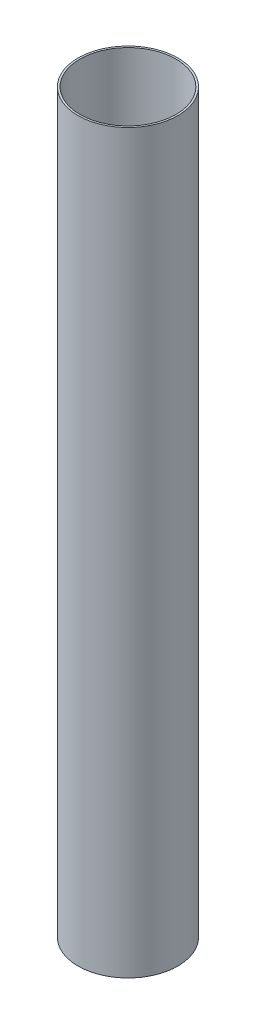
ISO-10303-21;
HEADER;
FILE_DESCRIPTION(('STEP AP214'),'2;1');
FILE_NAME('part.step','',(''),(''),'','','');
FILE_SCHEMA(('AUTOMOTIVE_DESIGN { 1 0 10303 214 1 1 1 1 }'));
ENDSEC;
DATA;
#1=APPLICATION_CONTEXT('core data for automotive mechanical design processes');
#2=APPLICATION_PROTOCOL_DEFINITION('international standard','automotive_design',2000,#1);
#3=PRODUCT_CONTEXT('',#1,'mechanical');
#4=PRODUCT('Part','Part','',(#3));
#5=PRODUCT_RELATED_PRODUCT_CATEGORY('part','',(#4));
#6=PRODUCT_DEFINITION_FORMATION('','',#4);
#7=PRODUCT_DEFINITION_CONTEXT('part definition',#1,'design');
#8=PRODUCT_DEFINITION('design','',#6,#7);
#9=PRODUCT_DEFINITION_SHAPE('','',#8);
#10=(LENGTH_UNIT() NAMED_UNIT(*) SI_UNIT(.MILLI.,.METRE.));
#11=(NAMED_UNIT(*) PLANE_ANGLE_UNIT() SI_UNIT($,.RADIAN.));
#12=(NAMED_UNIT(*) SI_UNIT($,.STERADIAN.) SOLID_ANGLE_UNIT());
#13=UNCERTAINTY_MEASURE_WITH_UNIT(LENGTH_MEASURE(1.E-05),#10,'distance_accuracy_value','');
#14=(GEOMETRIC_REPRESENTATION_CONTEXT(3) GLOBAL_UNCERTAINTY_ASSIGNED_CONTEXT((#13)) GLOBAL_UNIT_ASSIGNED_CONTEXT((#10,
#11,#12)) REPRESENTATION_CONTEXT('',''));
#15=CARTESIAN_POINT('',(0.,0.,0.));
#16=DIRECTION('',(0.,0.,1.));
#17=DIRECTION('',(1.,0.,0.));
#18=AXIS2_PLACEMENT_3D('',#15,#16,#17);
#19=CARTESIAN_POINT('',(-10.0304635416921,584.2,-2.71278445786671));
#20=DIRECTION('',(0.,1.,0.));
#21=DIRECTION('',(0.,0.,1.));
#22=AXIS2_PLACEMENT_3D('',#19,#20,#21);
#23=PLANE('',#22);
#24=CARTESIAN_POINT('',(-10.0304635416921,584.2,-2.71278445786671));
#25=DIRECTION('',(0.,1.,0.));
#26=DIRECTION('',(0.,0.,1.));
#27=AXIS2_PLACEMENT_3D('',#24,#25,#26);
#28=CIRCLE('',#27,39.6);
#29=CARTESIAN_POINT('',(-10.0304635416921,584.2,36.8872155421333));
#30=VERTEX_POINT('',#29);
#31=EDGE_CURVE('E10',#30,#30,#28,.T.);
#32=ORIENTED_EDGE('',*,*,#31,.T.);
#33=EDGE_LOOP('',(#32));
#34=FACE_BOUND('',#33,.T.);
#35=CARTESIAN_POINT('',(-10.0304635416921,584.2,-2.71278445786671));
#36=DIRECTION('',(0.,1.,0.));
#37=DIRECTION('',(0.,0.,1.));
#38=AXIS2_PLACEMENT_3D('',#35,#36,#37);
#39=CIRCLE('',#38,38.1);
#40=CARTESIAN_POINT('',(-10.0304635416921,584.2,35.3872155421333));
#41=VERTEX_POINT('',#40);
#42=EDGE_CURVE('E56',#41,#41,#39,.T.);
#43=ORIENTED_EDGE('',*,*,#42,.F.);
#44=EDGE_LOOP('',(#43));
#45=FACE_BOUND('',#44,.T.);
#46=ADVANCED_FACE('F43',(#34,#45),#23,.T.);
#47=CARTESIAN_POINT('',(-10.0304635416921,0.,-2.71278445786671));
#48=DIRECTION('',(0.,1.,0.));
#49=DIRECTION('',(0.,0.,1.));
#50=AXIS2_PLACEMENT_3D('',#47,#48,#49);
#51=PLANE('',#50);
#52=CARTESIAN_POINT('',(-10.0304635416921,0.,-2.71278445786671));
#53=DIRECTION('',(0.,1.,0.));
#54=DIRECTION('',(0.,0.,1.));
#55=AXIS2_PLACEMENT_3D('',#52,#53,#54);
#56=CIRCLE('',#55,39.6);
#57=CARTESIAN_POINT('',(-10.0304635416921,0.,36.8872155421333));
#58=VERTEX_POINT('',#57);
#59=EDGE_CURVE('E47',#58,#58,#56,.T.);
#60=ORIENTED_EDGE('',*,*,#59,.F.);
#61=EDGE_LOOP('',(#60));
#62=FACE_BOUND('',#61,.T.);
#63=CARTESIAN_POINT('',(-10.0304635416921,0.,-2.71278445786671));
#64=DIRECTION('',(0.,1.,0.));
#65=DIRECTION('',(0.,0.,1.));
#66=AXIS2_PLACEMENT_3D('',#63,#64,#65);
#67=CIRCLE('',#66,38.1);
#68=CARTESIAN_POINT('',(-10.0304635416921,0.,35.3872155421333));
#69=VERTEX_POINT('',#68);
#70=EDGE_CURVE('E58',#69,#69,#67,.T.);
#71=ORIENTED_EDGE('',*,*,#70,.T.);
#72=EDGE_LOOP('',(#71));
#73=FACE_BOUND('',#72,.T.);
#74=ADVANCED_FACE('F70',(#62,#73),#51,.F.);
#75=CARTESIAN_POINT('',(-10.0304635416921,584.2,-2.71278445786671));
#76=DIRECTION('',(0.,-1.,0.));
#77=DIRECTION('',(0.,0.,-1.));
#78=AXIS2_PLACEMENT_3D('',#75,#76,#77);
#79=CYLINDRICAL_SURFACE('',#78,39.6);
#80=ORIENTED_EDGE('',*,*,#31,.F.);
#81=EDGE_LOOP('',(#80));
#82=FACE_BOUND('',#81,.T.);
#83=ORIENTED_EDGE('',*,*,#59,.T.);
#84=EDGE_LOOP('',(#83));
#85=FACE_BOUND('',#84,.T.);
#86=ADVANCED_FACE('F45',(#82,#85),#79,.T.);
#87=CARTESIAN_POINT('',(-10.0304635416921,584.2,-2.71278445786671));
#88=DIRECTION('',(0.,-1.,0.));
#89=DIRECTION('',(0.,0.,-1.));
#90=AXIS2_PLACEMENT_3D('',#87,#88,#89);
#91=CYLINDRICAL_SURFACE('',#90,38.1);
#92=ORIENTED_EDGE('',*,*,#42,.T.);
#93=EDGE_LOOP('',(#92));
#94=FACE_BOUND('',#93,.T.);
#95=ORIENTED_EDGE('',*,*,#70,.F.);
#96=EDGE_LOOP('',(#95));
#97=FACE_BOUND('',#96,.T.);
#98=ADVANCED_FACE('F66',(#94,#97),#91,.F.);
#99=CLOSED_SHELL('',(#46,#74,#86,#98));
#100=MANIFOLD_SOLID_BREP('B2',#99);
#101=ADVANCED_BREP_SHAPE_REPRESENTATION('',(#18,#100),#14);
#102=SHAPE_DEFINITION_REPRESENTATION(#9,#101);
ENDSEC;
END-ISO-10303-21;
